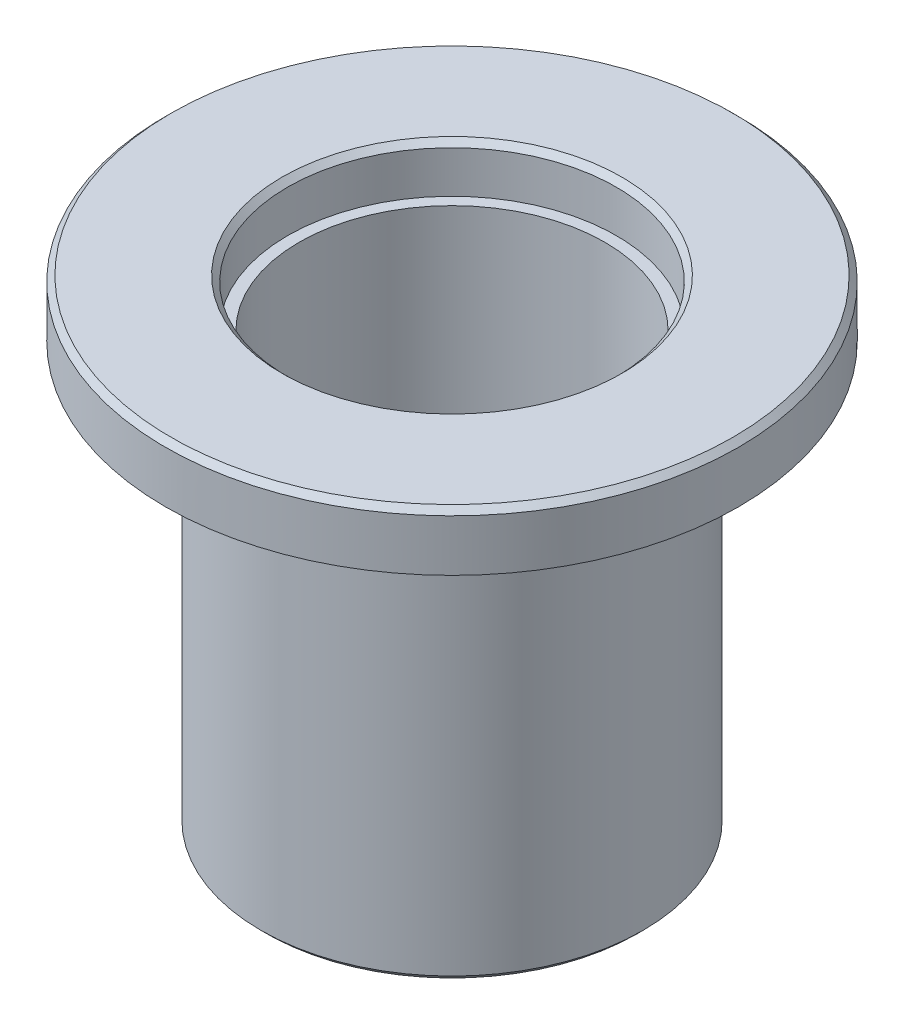
ISO-10303-21;
HEADER;
FILE_DESCRIPTION(('STEP AP214'),'2;1');
FILE_NAME('part.step','',(''),(''),'','','');
FILE_SCHEMA(('AUTOMOTIVE_DESIGN { 1 0 10303 214 1 1 1 1 }'));
ENDSEC;
DATA;
#1=APPLICATION_CONTEXT('core data for automotive mechanical design processes');
#2=APPLICATION_PROTOCOL_DEFINITION('international standard','automotive_design',2000,#1);
#3=PRODUCT_CONTEXT('',#1,'mechanical');
#4=PRODUCT('Part','Part','',(#3));
#5=PRODUCT_RELATED_PRODUCT_CATEGORY('part','',(#4));
#6=PRODUCT_DEFINITION_FORMATION('','',#4);
#7=PRODUCT_DEFINITION_CONTEXT('part definition',#1,'design');
#8=PRODUCT_DEFINITION('design','',#6,#7);
#9=PRODUCT_DEFINITION_SHAPE('','',#8);
#10=(LENGTH_UNIT() NAMED_UNIT(*) SI_UNIT(.MILLI.,.METRE.));
#11=(NAMED_UNIT(*) PLANE_ANGLE_UNIT() SI_UNIT($,.RADIAN.));
#12=(NAMED_UNIT(*) SI_UNIT($,.STERADIAN.) SOLID_ANGLE_UNIT());
#13=UNCERTAINTY_MEASURE_WITH_UNIT(LENGTH_MEASURE(1.E-05),#10,'distance_accuracy_value','');
#14=(GEOMETRIC_REPRESENTATION_CONTEXT(3) GLOBAL_UNCERTAINTY_ASSIGNED_CONTEXT((#13)) GLOBAL_UNIT_ASSIGNED_CONTEXT((#10,
#11,#12)) REPRESENTATION_CONTEXT('',''));
#15=CARTESIAN_POINT('',(0.,0.,0.));
#16=DIRECTION('',(0.,0.,1.));
#17=DIRECTION('',(1.,0.,0.));
#18=AXIS2_PLACEMENT_3D('',#15,#16,#17);
#19=CARTESIAN_POINT('',(15.,-3.669872981078,0.));
#20=DIRECTION('',(0.,1.,0.));
#21=DIRECTION('',(1.,0.,0.));
#22=AXIS2_PLACEMENT_3D('',#19,#20,#21);
#23=CONICAL_SURFACE('',#22,12.5,1.30899693899575);
#24=CARTESIAN_POINT('',(15.,-3.,0.));
#25=DIRECTION('',(0.,1.,0.));
#26=DIRECTION('',(-1.,0.,0.));
#27=AXIS2_PLACEMENT_3D('',#24,#25,#26);
#28=CIRCLE('',#27,15.);
#29=CARTESIAN_POINT('',(30.,-3.,0.));
#30=VERTEX_POINT('',#29);
#31=CARTESIAN_POINT('',(0.,-3.00000000000018,0.));
#32=VERTEX_POINT('',#31);
#33=EDGE_CURVE('E122',#30,#32,#28,.T.);
#34=ORIENTED_EDGE('',*,*,#33,.F.);
#35=CARTESIAN_POINT('',(15.,-3.,0.));
#36=DIRECTION('',(0.,1.,0.));
#37=DIRECTION('',(-1.,0.,0.));
#38=AXIS2_PLACEMENT_3D('',#35,#36,#37);
#39=CIRCLE('',#38,15.);
#40=EDGE_CURVE('E126',#32,#30,#39,.T.);
#41=ORIENTED_EDGE('',*,*,#40,.F.);
#42=DIRECTION('',(0.965925826289068,-0.258819045102521,0.));
#43=VECTOR('',#42,1.);
#44=CARTESIAN_POINT('',(2.5,-3.669872981078,0.));
#45=LINE('',#44,#43);
#46=CARTESIAN_POINT('',(5.,-4.33974596215582,0.));
#47=VERTEX_POINT('',#46);
#48=EDGE_CURVE('E11',#32,#47,#45,.T.);
#49=ORIENTED_EDGE('',*,*,#48,.T.);
#50=CARTESIAN_POINT('',(15.,-4.339745962156,0.));
#51=DIRECTION('',(0.,-1.,0.));
#52=DIRECTION('',(-1.,0.,0.));
#53=AXIS2_PLACEMENT_3D('',#50,#51,#52);
#54=CIRCLE('',#53,10.);
#55=CARTESIAN_POINT('',(25.,-4.339745962156,0.));
#56=VERTEX_POINT('',#55);
#57=EDGE_CURVE('E165',#56,#47,#54,.T.);
#58=ORIENTED_EDGE('',*,*,#57,.F.);
#59=CARTESIAN_POINT('',(15.,-4.339745962156,0.));
#60=DIRECTION('',(0.,-1.,0.));
#61=DIRECTION('',(-1.,0.,0.));
#62=AXIS2_PLACEMENT_3D('',#59,#60,#61);
#63=CIRCLE('',#62,10.);
#64=EDGE_CURVE('E28',#47,#56,#63,.T.);
#65=ORIENTED_EDGE('',*,*,#64,.F.);
#66=ORIENTED_EDGE('',*,*,#48,.F.);
#67=EDGE_LOOP('',(#34,#41,#49,#58,#65,#66));
#68=FACE_BOUND('',#67,.T.);
#69=ADVANCED_FACE('F17',(#68),#23,.T.);
#70=CARTESIAN_POINT('',(15.,1.25,0.));
#71=DIRECTION('',(0.,-1.,0.));
#72=DIRECTION('',(-1.,0.,0.));
#73=AXIS2_PLACEMENT_3D('',#70,#71,#72);
#74=CYLINDRICAL_SURFACE('',#73,10.);
#75=CARTESIAN_POINT('',(15.,-24.7,0.));
#76=DIRECTION('',(0.,-1.,0.));
#77=DIRECTION('',(-1.,0.,0.));
#78=AXIS2_PLACEMENT_3D('',#75,#76,#77);
#79=CIRCLE('',#78,10.);
#80=CARTESIAN_POINT('',(25.,-24.7,0.));
#81=VERTEX_POINT('',#80);
#82=CARTESIAN_POINT('',(5.,-24.7,0.));
#83=VERTEX_POINT('',#82);
#84=EDGE_CURVE('E135',#81,#83,#79,.T.);
#85=ORIENTED_EDGE('',*,*,#84,.F.);
#86=DIRECTION('',(0.,1.,0.));
#87=VECTOR('',#86,1.);
#88=CARTESIAN_POINT('',(25.,1.25,0.));
#89=LINE('',#88,#87);
#90=EDGE_CURVE('E77',#81,#56,#89,.T.);
#91=ORIENTED_EDGE('',*,*,#90,.T.);
#92=ORIENTED_EDGE('',*,*,#57,.T.);
#93=ORIENTED_EDGE('',*,*,#64,.T.);
#94=ORIENTED_EDGE('',*,*,#90,.F.);
#95=CARTESIAN_POINT('',(15.,-24.7,0.));
#96=DIRECTION('',(0.,-1.,0.));
#97=DIRECTION('',(-1.,0.,0.));
#98=AXIS2_PLACEMENT_3D('',#95,#96,#97);
#99=CIRCLE('',#98,10.);
#100=EDGE_CURVE('E68',#83,#81,#99,.T.);
#101=ORIENTED_EDGE('',*,*,#100,.F.);
#102=EDGE_LOOP('',(#85,#91,#92,#93,#94,#101));
#103=FACE_BOUND('',#102,.T.);
#104=ADVANCED_FACE('F173',(#103),#74,.T.);
#105=CARTESIAN_POINT('',(15.,-24.85,0.));
#106=DIRECTION('',(0.,1.,0.));
#107=DIRECTION('',(1.,0.,0.));
#108=AXIS2_PLACEMENT_3D('',#105,#106,#107);
#109=CONICAL_SURFACE('',#108,9.85,0.785398163397448);
#110=ORIENTED_EDGE('',*,*,#84,.T.);
#111=DIRECTION('',(0.707106781186548,-0.707106781186548,0.));
#112=VECTOR('',#111,1.);
#113=CARTESIAN_POINT('',(5.15,-24.85,0.));
#114=LINE('',#113,#112);
#115=CARTESIAN_POINT('',(5.3,-25.,0.));
#116=VERTEX_POINT('',#115);
#117=EDGE_CURVE('E132',#83,#116,#114,.T.);
#118=ORIENTED_EDGE('',*,*,#117,.T.);
#119=CARTESIAN_POINT('',(15.,-25.,0.));
#120=DIRECTION('',(0.,-1.,0.));
#121=DIRECTION('',(-1.,0.,0.));
#122=AXIS2_PLACEMENT_3D('',#119,#120,#121);
#123=CIRCLE('',#122,9.7);
#124=EDGE_CURVE('E163',#116,#116,#123,.T.);
#125=ORIENTED_EDGE('',*,*,#124,.F.);
#126=ORIENTED_EDGE('',*,*,#117,.F.);
#127=ORIENTED_EDGE('',*,*,#100,.T.);
#128=EDGE_LOOP('',(#110,#118,#125,#126,#127));
#129=FACE_BOUND('',#128,.T.);
#130=ADVANCED_FACE('F171',(#129),#109,.T.);
#131=CARTESIAN_POINT('',(15.,-25.,0.));
#132=DIRECTION('',(0.,-1.,0.));
#133=DIRECTION('',(0.,0.,-1.));
#134=AXIS2_PLACEMENT_3D('',#131,#132,#133);
#135=PLANE('',#134);
#136=CARTESIAN_POINT('',(15.,-25.,0.));
#137=DIRECTION('',(0.,-1.,0.));
#138=DIRECTION('',(1.,0.,0.));
#139=AXIS2_PLACEMENT_3D('',#136,#137,#138);
#140=CIRCLE('',#139,8.);
#141=CARTESIAN_POINT('',(23.,-25.,0.));
#142=VERTEX_POINT('',#141);
#143=EDGE_CURVE('E148',#142,#142,#140,.T.);
#144=ORIENTED_EDGE('',*,*,#143,.F.);
#145=EDGE_LOOP('',(#144));
#146=FACE_BOUND('',#145,.T.);
#147=ORIENTED_EDGE('',*,*,#124,.T.);
#148=EDGE_LOOP('',(#147));
#149=FACE_BOUND('',#148,.T.);
#150=ADVANCED_FACE('F212',(#146,#149),#135,.T.);
#151=CARTESIAN_POINT('',(15.,1.25,0.));
#152=DIRECTION('',(0.,-1.,0.));
#153=DIRECTION('',(-1.,0.,0.));
#154=AXIS2_PLACEMENT_3D('',#151,#152,#153);
#155=CYLINDRICAL_SURFACE('',#154,8.);
#156=CARTESIAN_POINT('',(15.,-2.5,0.));
#157=DIRECTION('',(0.,-1.,0.));
#158=DIRECTION('',(-1.,0.,0.));
#159=AXIS2_PLACEMENT_3D('',#156,#157,#158);
#160=CIRCLE('',#159,8.);
#161=CARTESIAN_POINT('',(23.,-2.5,0.));
#162=VERTEX_POINT('',#161);
#163=EDGE_CURVE('E140',#162,#162,#160,.T.);
#164=ORIENTED_EDGE('',*,*,#163,.F.);
#165=DIRECTION('',(0.,-1.,0.));
#166=VECTOR('',#165,1.);
#167=CARTESIAN_POINT('',(23.,1.25,0.));
#168=LINE('',#167,#166);
#169=EDGE_CURVE('E144',#162,#142,#168,.T.);
#170=ORIENTED_EDGE('',*,*,#169,.T.);
#171=ORIENTED_EDGE('',*,*,#143,.T.);
#172=ORIENTED_EDGE('',*,*,#169,.F.);
#173=EDGE_LOOP('',(#164,#170,#171,#172));
#174=FACE_BOUND('',#173,.T.);
#175=ADVANCED_FACE('F208',(#174),#155,.F.);
#176=CARTESIAN_POINT('',(15.,-2.5,0.));
#177=DIRECTION('',(0.,-1.,0.));
#178=DIRECTION('',(0.,0.,-1.));
#179=AXIS2_PLACEMENT_3D('',#176,#177,#178);
#180=PLANE('',#179);
#181=ORIENTED_EDGE('',*,*,#163,.T.);
#182=EDGE_LOOP('',(#181));
#183=FACE_BOUND('',#182,.T.);
#184=CARTESIAN_POINT('',(15.,-2.5,0.));
#185=DIRECTION('',(0.,-1.,0.));
#186=DIRECTION('',(-1.,0.,0.));
#187=AXIS2_PLACEMENT_3D('',#184,#185,#186);
#188=CIRCLE('',#187,8.6);
#189=CARTESIAN_POINT('',(23.6,-2.5,0.));
#190=VERTEX_POINT('',#189);
#191=EDGE_CURVE('E131',#190,#190,#188,.T.);
#192=ORIENTED_EDGE('',*,*,#191,.F.);
#193=EDGE_LOOP('',(#192));
#194=FACE_BOUND('',#193,.T.);
#195=ADVANCED_FACE('F204',(#183,#194),#180,.F.);
#196=CARTESIAN_POINT('',(15.,1.25,0.));
#197=DIRECTION('',(0.,-1.,0.));
#198=DIRECTION('',(-1.,0.,0.));
#199=AXIS2_PLACEMENT_3D('',#196,#197,#198);
#200=CYLINDRICAL_SURFACE('',#199,8.6);
#201=CARTESIAN_POINT('',(15.,-0.3,0.));
#202=DIRECTION('',(0.,-1.,0.));
#203=DIRECTION('',(-1.,0.,0.));
#204=AXIS2_PLACEMENT_3D('',#201,#202,#203);
#205=CIRCLE('',#204,8.6);
#206=CARTESIAN_POINT('',(23.6,-0.3,0.));
#207=VERTEX_POINT('',#206);
#208=CARTESIAN_POINT('',(6.4,-0.3,0.));
#209=VERTEX_POINT('',#208);
#210=EDGE_CURVE('E96',#207,#209,#205,.T.);
#211=ORIENTED_EDGE('',*,*,#210,.F.);
#212=DIRECTION('',(0.,-1.,0.));
#213=VECTOR('',#212,1.);
#214=CARTESIAN_POINT('',(23.6,1.25,0.));
#215=LINE('',#214,#213);
#216=EDGE_CURVE('E127',#207,#190,#215,.T.);
#217=ORIENTED_EDGE('',*,*,#216,.T.);
#218=ORIENTED_EDGE('',*,*,#191,.T.);
#219=ORIENTED_EDGE('',*,*,#216,.F.);
#220=CARTESIAN_POINT('',(15.,-0.3,0.));
#221=DIRECTION('',(0.,-1.,0.));
#222=DIRECTION('',(-1.,0.,0.));
#223=AXIS2_PLACEMENT_3D('',#220,#221,#222);
#224=CIRCLE('',#223,8.6);
#225=EDGE_CURVE('E98',#209,#207,#224,.T.);
#226=ORIENTED_EDGE('',*,*,#225,.F.);
#227=EDGE_LOOP('',(#211,#217,#218,#219,#226));
#228=FACE_BOUND('',#227,.T.);
#229=ADVANCED_FACE('F201',(#228),#200,.F.);
#230=CARTESIAN_POINT('',(15.,-0.15,0.));
#231=DIRECTION('',(0.,1.,0.));
#232=DIRECTION('',(1.,0.,0.));
#233=AXIS2_PLACEMENT_3D('',#230,#231,#232);
#234=CONICAL_SURFACE('',#233,8.75,0.785398163397448);
#235=ORIENTED_EDGE('',*,*,#210,.T.);
#236=DIRECTION('',(-0.707106781186548,0.707106781186548,0.));
#237=VECTOR('',#236,1.);
#238=CARTESIAN_POINT('',(6.25,-0.15,0.));
#239=LINE('',#238,#237);
#240=CARTESIAN_POINT('',(6.1,0.,0.));
#241=VERTEX_POINT('',#240);
#242=EDGE_CURVE('E91',#209,#241,#239,.T.);
#243=ORIENTED_EDGE('',*,*,#242,.T.);
#244=CARTESIAN_POINT('',(15.,0.,0.));
#245=DIRECTION('',(0.,-1.,0.));
#246=DIRECTION('',(-1.,0.,0.));
#247=AXIS2_PLACEMENT_3D('',#244,#245,#246);
#248=CIRCLE('',#247,8.9);
#249=EDGE_CURVE('E21',#241,#241,#248,.T.);
#250=ORIENTED_EDGE('',*,*,#249,.F.);
#251=ORIENTED_EDGE('',*,*,#242,.F.);
#252=ORIENTED_EDGE('',*,*,#225,.T.);
#253=EDGE_LOOP('',(#235,#243,#250,#251,#252));
#254=FACE_BOUND('',#253,.T.);
#255=ADVANCED_FACE('F93',(#254),#234,.F.);
#256=CARTESIAN_POINT('',(15.,0.,0.));
#257=DIRECTION('',(0.,-1.,0.));
#258=DIRECTION('',(0.,0.,-1.));
#259=AXIS2_PLACEMENT_3D('',#256,#257,#258);
#260=PLANE('',#259);
#261=ORIENTED_EDGE('',*,*,#249,.T.);
#262=EDGE_LOOP('',(#261));
#263=FACE_BOUND('',#262,.T.);
#264=CARTESIAN_POINT('',(15.,0.,0.));
#265=DIRECTION('',(0.,1.,0.));
#266=DIRECTION('',(-1.,0.,0.));
#267=AXIS2_PLACEMENT_3D('',#264,#265,#266);
#268=CIRCLE('',#267,14.7);
#269=CARTESIAN_POINT('',(29.7,0.,0.));
#270=VERTEX_POINT('',#269);
#271=EDGE_CURVE('E104',#270,#270,#268,.T.);
#272=ORIENTED_EDGE('',*,*,#271,.T.);
#273=EDGE_LOOP('',(#272));
#274=FACE_BOUND('',#273,.T.);
#275=ADVANCED_FACE('F101',(#263,#274),#260,.F.);
#276=CARTESIAN_POINT('',(15.,-0.15,0.));
#277=DIRECTION('',(0.,-1.,0.));
#278=DIRECTION('',(-1.,0.,0.));
#279=AXIS2_PLACEMENT_3D('',#276,#277,#278);
#280=CONICAL_SURFACE('',#279,14.85,0.785398163397448);
#281=CARTESIAN_POINT('',(15.,-0.3,0.));
#282=DIRECTION('',(0.,-1.,0.));
#283=DIRECTION('',(-1.,0.,0.));
#284=AXIS2_PLACEMENT_3D('',#281,#282,#283);
#285=CIRCLE('',#284,15.);
#286=CARTESIAN_POINT('',(30.,-0.3,0.));
#287=VERTEX_POINT('',#286);
#288=EDGE_CURVE('E118',#287,#287,#285,.T.);
#289=ORIENTED_EDGE('',*,*,#288,.F.);
#290=DIRECTION('',(-0.707106781186548,0.707106781186548,0.));
#291=VECTOR('',#290,1.);
#292=CARTESIAN_POINT('',(29.85,-0.15,0.));
#293=LINE('',#292,#291);
#294=EDGE_CURVE('E111',#287,#270,#293,.T.);
#295=ORIENTED_EDGE('',*,*,#294,.T.);
#296=ORIENTED_EDGE('',*,*,#271,.F.);
#297=ORIENTED_EDGE('',*,*,#294,.F.);
#298=EDGE_LOOP('',(#289,#295,#296,#297));
#299=FACE_BOUND('',#298,.T.);
#300=ADVANCED_FACE('F197',(#299),#280,.T.);
#301=CARTESIAN_POINT('',(15.,1.25,0.));
#302=DIRECTION('',(0.,-1.,0.));
#303=DIRECTION('',(-1.,0.,0.));
#304=AXIS2_PLACEMENT_3D('',#301,#302,#303);
#305=CYLINDRICAL_SURFACE('',#304,15.);
#306=ORIENTED_EDGE('',*,*,#33,.T.);
#307=ORIENTED_EDGE('',*,*,#40,.T.);
#308=DIRECTION('',(0.,1.,0.));
#309=VECTOR('',#308,1.);
#310=CARTESIAN_POINT('',(30.,1.25,0.));
#311=LINE('',#310,#309);
#312=EDGE_CURVE('E136',#30,#287,#311,.T.);
#313=ORIENTED_EDGE('',*,*,#312,.T.);
#314=ORIENTED_EDGE('',*,*,#288,.T.);
#315=ORIENTED_EDGE('',*,*,#312,.F.);
#316=EDGE_LOOP('',(#306,#307,#313,#314,#315));
#317=FACE_BOUND('',#316,.T.);
#318=ADVANCED_FACE('F19',(#317),#305,.T.);
#319=CLOSED_SHELL('',(#69,#104,#130,#150,#175,#195,#229,#255,#275,#300,#318));
#320=MANIFOLD_SOLID_BREP('B1',#319);
#321=ADVANCED_BREP_SHAPE_REPRESENTATION('',(#18,#320),#14);
#322=SHAPE_DEFINITION_REPRESENTATION(#9,#321);
ENDSEC;
END-ISO-10303-21;
